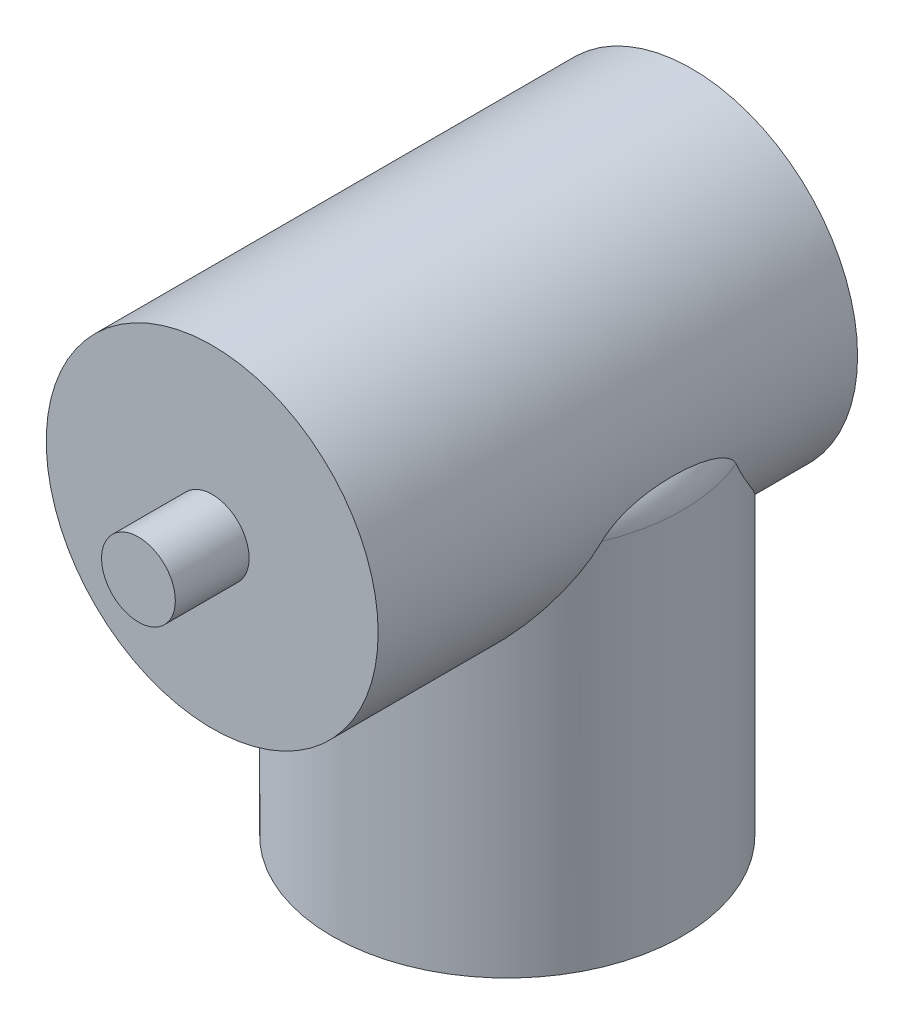
ISO-10303-21;
HEADER;
FILE_DESCRIPTION(('STEP AP214'),'2;1');
FILE_NAME('part.step','',(''),(''),'','','');
FILE_SCHEMA(('AUTOMOTIVE_DESIGN { 1 0 10303 214 1 1 1 1 }'));
ENDSEC;
DATA;
#1=APPLICATION_CONTEXT('core data for automotive mechanical design processes');
#2=APPLICATION_PROTOCOL_DEFINITION('international standard','automotive_design',2000,#1);
#3=PRODUCT_CONTEXT('',#1,'mechanical');
#4=PRODUCT('Part','Part','',(#3));
#5=PRODUCT_RELATED_PRODUCT_CATEGORY('part','',(#4));
#6=PRODUCT_DEFINITION_FORMATION('','',#4);
#7=PRODUCT_DEFINITION_CONTEXT('part definition',#1,'design');
#8=PRODUCT_DEFINITION('design','',#6,#7);
#9=PRODUCT_DEFINITION_SHAPE('','',#8);
#10=(LENGTH_UNIT() NAMED_UNIT(*) SI_UNIT(.MILLI.,.METRE.));
#11=(NAMED_UNIT(*) PLANE_ANGLE_UNIT() SI_UNIT($,.RADIAN.));
#12=(NAMED_UNIT(*) SI_UNIT($,.STERADIAN.) SOLID_ANGLE_UNIT());
#13=UNCERTAINTY_MEASURE_WITH_UNIT(LENGTH_MEASURE(1.E-05),#10,'distance_accuracy_value','');
#14=(GEOMETRIC_REPRESENTATION_CONTEXT(3) GLOBAL_UNCERTAINTY_ASSIGNED_CONTEXT((#13)) GLOBAL_UNIT_ASSIGNED_CONTEXT((#10,
#11,#12)) REPRESENTATION_CONTEXT('',''));
#15=CARTESIAN_POINT('',(0.,0.,0.));
#16=DIRECTION('',(0.,0.,1.));
#17=DIRECTION('',(1.,0.,0.));
#18=AXIS2_PLACEMENT_3D('',#15,#16,#17);
#19=CARTESIAN_POINT('',(0.,0.,130.));
#20=DIRECTION('',(0.,0.,-1.));
#21=DIRECTION('',(-1.,0.,0.));
#22=AXIS2_PLACEMENT_3D('',#19,#20,#21);
#23=CYLINDRICAL_SURFACE('',#22,45.);
#24=CARTESIAN_POINT('',(45.,0.,34.7930936742544));
#25=CARTESIAN_POINT('',(45.0000036282625,-0.240507951588875,34.7931160998261));
#26=CARTESIAN_POINT('',(44.998071195291,-0.480973921860188,34.7873848131458));
#27=CARTESIAN_POINT('',(44.9903722624058,-0.961261871798909,34.7646260219081));
#28=CARTESIAN_POINT('',(44.9846065392307,-1.20108397205098,34.7476008058382));
#29=CARTESIAN_POINT('',(44.9616573852844,-1.91757737206649,34.6800213031901));
#30=CARTESIAN_POINT('',(44.9388215194324,-2.3926015526503,34.6129608129489));
#31=CARTESIAN_POINT('',(44.8793568256426,-3.3253443360846,34.4403940057051));
#32=CARTESIAN_POINT('',(44.8429925161905,-3.78322048158098,34.3356261745172));
#33=CARTESIAN_POINT('',(44.757353575303,-4.68896816442022,34.0925829307832));
#34=CARTESIAN_POINT('',(44.7080699619074,-5.13683250517412,33.9542842114137));
#35=CARTESIAN_POINT('',(44.5635631856544,-6.2934252276618,33.5559461687162));
#36=CARTESIAN_POINT('',(44.4587286141598,-6.99316938807303,33.2733480959356));
#37=CARTESIAN_POINT('',(44.2213570020724,-8.36399233349041,32.6555143363363));
#38=CARTESIAN_POINT('',(44.0888003397471,-9.03505040706717,32.3202414082233));
#39=CARTESIAN_POINT('',(43.7967371617629,-10.3590815867803,31.6085468098105));
#40=CARTESIAN_POINT('',(43.6369354009632,-11.0117539558126,31.2316922803975));
#41=CARTESIAN_POINT('',(43.2931132328243,-12.2941818685559,30.4516449650358));
#42=CARTESIAN_POINT('',(43.1090978237685,-12.9239421077312,30.0484576234448));
#43=CARTESIAN_POINT('',(42.6922460870323,-14.2447270562184,29.1700157752598));
#44=CARTESIAN_POINT('',(42.4561725214174,-14.9330299130196,28.6922202778851));
#45=CARTESIAN_POINT('',(41.9549422766588,-16.2881759973451,27.7215009331251));
#46=CARTESIAN_POINT('',(41.6897792599685,-16.9550145074665,27.2285738060145));
#47=CARTESIAN_POINT('',(41.1304578077295,-18.2700948931789,26.2331802833347));
#48=CARTESIAN_POINT('',(40.8362745659815,-18.9183202366313,25.7307060283887));
#49=CARTESIAN_POINT('',(40.219145282569,-20.1971359564553,24.7211465473791));
#50=CARTESIAN_POINT('',(39.8962014987048,-20.8277277120258,24.214061686065));
#51=CARTESIAN_POINT('',(39.2222371655498,-22.0706716400943,23.2000783745839));
#52=CARTESIAN_POINT('',(38.8712916545365,-22.6830669000828,22.6931828557604));
#53=CARTESIAN_POINT('',(38.140299869527,-23.8917629003121,21.6811506678406));
#54=CARTESIAN_POINT('',(37.7602528798444,-24.4880632442461,21.17601404232));
#55=CARTESIAN_POINT('',(36.9708882048631,-25.6642702244276,20.1702857138484));
#56=CARTESIAN_POINT('',(36.5615858698652,-26.2441852383991,19.6696917804992));
#57=CARTESIAN_POINT('',(35.7131543471676,-27.3875397624245,18.6751224963607));
#58=CARTESIAN_POINT('',(35.2740262921399,-27.9509798969731,18.1811468950833));
#59=CARTESIAN_POINT('',(34.0583510323342,-29.4359228737015,16.8709897962685));
#60=CARTESIAN_POINT('',(33.2543128805492,-30.3421023822349,16.0626422985321));
#61=CARTESIAN_POINT('',(31.5589504668134,-32.1017995963853,14.4806021302215));
#62=CARTESIAN_POINT('',(30.6676179478878,-32.9553123078997,13.7069127479861));
#63=CARTESIAN_POINT('',(28.7969000585207,-34.6018568354736,12.2054965075945));
#64=CARTESIAN_POINT('',(27.8176268767559,-35.3949633906701,11.477713049292));
#65=CARTESIAN_POINT('',(26.2820643937557,-36.5329833506146,10.4287048121694));
#66=CARTESIAN_POINT('',(25.7591510445506,-36.9036859390092,10.0861751987775));
#67=CARTESIAN_POINT('',(24.6909062769729,-37.6267891452383,9.41667133435715));
#68=CARTESIAN_POINT('',(24.1455694193499,-37.97918527501,9.08970089949507));
#69=CARTESIAN_POINT('',(22.7492460410974,-38.8386965643132,8.29079287266678));
#70=CARTESIAN_POINT('',(21.8840686720489,-39.3331841110627,7.82985292098211));
#71=CARTESIAN_POINT('',(20.104962714454,-40.2715974246874,6.95324005146495));
#72=CARTESIAN_POINT('',(19.1910462142914,-40.715535644065,6.53755598624683));
#73=CARTESIAN_POINT('',(17.3170948529587,-41.5471876021261,5.7575089423702));
#74=CARTESIAN_POINT('',(16.3570720739146,-41.9349159647009,5.39313261589553));
#75=CARTESIAN_POINT('',(14.3944988304117,-42.6484209693281,4.72171351042527));
#76=CARTESIAN_POINT('',(13.3919477305607,-42.9741966853809,4.41467158840204));
#77=CARTESIAN_POINT('',(11.8562665987485,-43.4133208029996,4.00039061755079));
#78=CARTESIAN_POINT('',(11.3365387816943,-43.551973204426,3.86950511081296));
#79=CARTESIAN_POINT('',(10.2887304182122,-43.8113356390125,3.6245613925961));
#80=CARTESIAN_POINT('',(9.76065091693068,-43.9320478978852,3.51050109374001));
#81=CARTESIAN_POINT('',(8.69705781355228,-44.1549147495123,3.29983752451308));
#82=CARTESIAN_POINT('',(8.1615430676785,-44.2570664522411,3.20323697277557));
#83=CARTESIAN_POINT('',(7.0843501431601,-44.4422161841727,3.02809693766889));
#84=CARTESIAN_POINT('',(6.54267279180972,-44.5252167531986,2.94955505936367));
#85=CARTESIAN_POINT('',(5.45465409277616,-44.6715553170366,2.81104687512732));
#86=CARTESIAN_POINT('',(4.90831586886866,-44.7349055582274,2.75106899988191));
#87=CARTESIAN_POINT('',(3.81202333613277,-44.8416297853095,2.65001089977105));
#88=CARTESIAN_POINT('',(3.26206950803031,-44.8850063744878,2.60892821218203));
#89=CARTESIAN_POINT('',(2.15986187800102,-44.9515266176853,2.54592083082813));
#90=CARTESIAN_POINT('',(1.60760819989963,-44.9746713472048,2.52399511870236));
#91=CARTESIAN_POINT('',(0.50225262662826,-45.0005946278448,2.49943678536948));
#92=CARTESIAN_POINT('',(-0.0508492365161487,-45.0033739298595,2.4968034528325));
#93=CARTESIAN_POINT('',(-1.55441214284421,-44.9831843134049,2.51593093340261));
#94=CARTESIAN_POINT('',(-2.50450704385429,-44.9402555263611,2.5566020433076));
#95=CARTESIAN_POINT('',(-4.39575377643984,-44.7948346029611,2.69432724613187));
#96=CARTESIAN_POINT('',(-5.33690660479029,-44.6923491864812,2.7913749779802));
#97=CARTESIAN_POINT('',(-7.20384849015774,-44.429642834535,3.04000253090832));
#98=CARTESIAN_POINT('',(-8.12963676858981,-44.2694189825126,3.19158510671965));
#99=CARTESIAN_POINT('',(-9.95982483745956,-43.8939032031982,3.54657179106664));
#100=CARTESIAN_POINT('',(-10.8642236660164,-43.6786088045153,3.74997822529045));
#101=CARTESIAN_POINT('',(-12.6410440404598,-43.197754040548,4.2038245642162));
#102=CARTESIAN_POINT('',(-13.5136286179818,-42.9325124224432,4.45396614498949));
#103=CARTESIAN_POINT('',(-15.228660044957,-42.3545372534083,4.99836219852296));
#104=CARTESIAN_POINT('',(-16.0711080331654,-42.0418054993095,5.29261500229054));
#105=CARTESIAN_POINT('',(-17.7229569589944,-41.3725887701035,5.92134346339557));
#106=CARTESIAN_POINT('',(-18.5323549891554,-41.016099956619,6.2558226493466));
#107=CARTESIAN_POINT('',(-20.1160849836041,-40.2630368973174,6.96112550458363));
#108=CARTESIAN_POINT('',(-20.8904094814759,-39.8664541738855,7.33195685981064));
#109=CARTESIAN_POINT('',(-22.2061073786024,-39.1445593375431,8.00554404833076));
#110=CARTESIAN_POINT('',(-22.7557838695149,-38.8274620757475,8.30099028028921));
#111=CARTESIAN_POINT('',(-23.8345892468138,-38.1747270676997,8.90808550168421));
#112=CARTESIAN_POINT('',(-24.363721754583,-37.839092614585,9.21973161263253));
#113=CARTESIAN_POINT('',(-25.9205588803031,-36.8059280457755,10.1771534840128));
#114=CARTESIAN_POINT('',(-26.9174562905248,-36.0822731546245,10.8452852623041));
#115=CARTESIAN_POINT('',(-28.8306338032502,-34.5728785726371,12.2316982554511));
#116=CARTESIAN_POINT('',(-29.7466937254224,-33.7869797483682,12.9501074267727));
#117=CARTESIAN_POINT('',(-31.4965034195686,-32.1620217867968,14.4257175103004));
#118=CARTESIAN_POINT('',(-32.3302582901287,-31.322965947728,15.1829160151876));
#119=CARTESIAN_POINT('',(-33.6479225354269,-29.8900857560733,16.4649049427348));
#120=CARTESIAN_POINT('',(-34.1545927389672,-29.3095843852055,16.9814365058233));
#121=CARTESIAN_POINT('',(-35.1333427565068,-28.1289218173229,18.0248561467357));
#122=CARTESIAN_POINT('',(-35.6054202057411,-27.528759280319,18.5517449294636));
#123=CARTESIAN_POINT('',(-36.5157344463686,-26.3093225196826,19.6134828802533));
#124=CARTESIAN_POINT('',(-36.9539512249926,-25.6900372919729,20.1483365364462));
#125=CARTESIAN_POINT('',(-37.7967562491841,-24.4331283314578,21.2229014765962));
#126=CARTESIAN_POINT('',(-38.201345591466,-23.7955051976327,21.7626126014965));
#127=CARTESIAN_POINT('',(-38.9768487035338,-22.5027272332834,22.8431067707508));
#128=CARTESIAN_POINT('',(-39.3478063716351,-21.8475967448983,23.3838874481645));
#129=CARTESIAN_POINT('',(-40.0570157652837,-20.5183591798848,24.4636991714409));
#130=CARTESIAN_POINT('',(-40.3952651068922,-19.8442507246679,25.0027300870097));
#131=CARTESIAN_POINT('',(-41.038922442814,-18.4764107832329,26.0741353189306));
#132=CARTESIAN_POINT('',(-41.3443580320239,-17.7826964148081,26.6065148904433));
#133=CARTESIAN_POINT('',(-41.9225830293313,-16.3730721494187,27.6592908295468));
#134=CARTESIAN_POINT('',(-42.1953791816356,-15.6571668763318,28.1796896546806));
#135=CARTESIAN_POINT('',(-42.6480783134051,-14.3698263885657,29.0815064542531));
#136=CARTESIAN_POINT('',(-42.834803780037,-13.8036604954542,29.4670194078451));
#137=CARTESIAN_POINT('',(-43.1883442604206,-12.6541928061568,30.2214685707377));
#138=CARTESIAN_POINT('',(-43.3551585922286,-12.0708904239092,30.5904042120061));
#139=CARTESIAN_POINT('',(-43.6679883970757,-10.8849778475441,31.3048468956195));
#140=CARTESIAN_POINT('',(-43.8140138140445,-10.2823770545214,31.6503650974722));
#141=CARTESIAN_POINT('',(-44.0840562522068,-9.05487400896909,32.3089734384497));
#142=CARTESIAN_POINT('',(-44.2080804189199,-8.42997907657094,32.622074092272));
#143=CARTESIAN_POINT('',(-44.3995733951759,-7.3408571751413,33.1187416202363));
#144=CARTESIAN_POINT('',(-44.4729970848857,-6.88279565239096,33.3134883442857));
#145=CARTESIAN_POINT('',(-44.6068889315348,-5.95363326303694,33.6747878693232));
#146=CARTESIAN_POINT('',(-44.6673557561122,-5.48253106107184,33.8413377704466));
#147=CARTESIAN_POINT('',(-44.7739840512567,-4.52979824938127,34.139187950024));
#148=CARTESIAN_POINT('',(-44.8202047187658,-4.04822035942632,34.2706337832357));
#149=CARTESIAN_POINT('',(-44.8974862314992,-3.07469554903564,34.492594130078));
#150=CARTESIAN_POINT('',(-44.9285586829263,-2.58275686923047,34.5831399763858));
#151=CARTESIAN_POINT('',(-44.9675877777653,-1.74223144878157,34.6974321018896));
#152=CARTESIAN_POINT('',(-44.9796975382166,-1.39543721945125,34.7331106183338));
#153=CARTESIAN_POINT('',(-44.9959257211095,-0.699132593703697,34.7810366522511));
#154=CARTESIAN_POINT('',(-45.0000228521314,-0.349617431613069,34.7932217410149));
#155=CARTESIAN_POINT('',(-45.,0.,34.7930936742545));
#156=B_SPLINE_CURVE_WITH_KNOTS('',3,(#24,#25,#26,#27,#28,#29,#30,#31,#32,#33,#34,#35,#36,#37,
#38,#39,#40,#41,#42,#43,#44,#45,#46,#47,#48,#49,#50,#51,#52,#53,#54,#55,#56,#57,#58,#59,#60,#61,
#62,#63,#64,#65,#66,#67,#68,#69,#70,#71,#72,#73,#74,#75,#76,#77,#78,#79,#80,#81,#82,#83,#84,#85,
#86,#87,#88,#89,#90,#91,#92,#93,#94,#95,#96,#97,#98,#99,#100,#101,#102,#103,#104,#105,#106,#107,
#108,#109,#110,#111,#112,#113,#114,#115,#116,#117,#118,#119,#120,#121,#122,#123,#124,#125,#126,
#127,#128,#129,#130,#131,#132,#133,#134,#135,#136,#137,#138,#139,#140,#141,#142,#143,#144,#145,
#146,#147,#148,#149,#150,#151,#152,#153,#154,#155),.UNSPECIFIED.,.F.,.F.,(4,2,2,2,2,2,2,2,2,2,2,
2,2,2,2,2,2,2,2,2,2,2,2,2,2,2,2,2,2,2,2,2,2,2,2,2,2,2,2,2,2,2,2,2,2,2,2,2,2,2,2,2,2,2,2,2,2,2,2,
2,2,2,2,2,2,4),(0.,0.721367829363491,1.44258953268556,2.8810732361752,4.29279435491907,
5.70549956753271,7.98712620684768,10.2703732835571,12.5801503739989,14.8894514163008,
17.4999345441541,20.1109875362427,22.7242920955627,25.3373916821268,27.9437098923643,
30.5500922198075,33.155116876118,35.7600426583572,40.1252211899129,44.4908130132465,
48.850912554678,51.030573654804,53.2107666289942,56.50153702111,59.7914949911584,
63.0805954841428,66.3697451350923,68.0300394022811,69.6901275156903,71.3504738968749,
73.0105999562304,74.669689311723,76.3285623667913,77.9873472328733,79.6460709375443,
82.4979806020513,85.3495685431834,88.2013005474848,91.0531605509001,93.8874024772038,
96.7215371941588,99.5559206998414,102.390904777225,104.490134752838,106.588992991719,
110.78763462632,114.997380359598,119.206865146098,121.988927338962,124.771179536864,
127.555063755173,130.338857145126,133.118962991697,135.899271313161,138.677222909346,
141.454599509278,143.58389319889,145.713259794532,147.84160440651,149.969256508612,
151.477729406115,152.986357346386,154.488629247572,155.989748327748,157.035410786488,
158.083848058377),.UNSPECIFIED.);
#157=CARTESIAN_POINT('',(43.8748219369606,-9.99999999999999,31.7997252767987));
#158=VERTEX_POINT('',#157);
#159=CARTESIAN_POINT('',(-43.8748219369606,-9.99999999999999,31.7997252767987));
#160=VERTEX_POINT('',#159);
#161=EDGE_CURVE('E74',#158,#160,#156,.T.);
#162=ORIENTED_EDGE('',*,*,#161,.T.);
#163=CARTESIAN_POINT('',(-43.8748219369606,-9.99999999999999,31.7997252767987));
#164=CARTESIAN_POINT('',(-43.9290445672907,-9.76206935781008,31.9304979417745));
#165=CARTESIAN_POINT('',(-43.9794932620527,-9.53182366959213,32.0758524352412));
#166=CARTESIAN_POINT('',(-44.0733699236913,-9.08787784167482,32.3905726903264));
#167=CARTESIAN_POINT('',(-44.1168196435094,-8.87412755687374,32.5598608599886));
#168=CARTESIAN_POINT('',(-44.1969179466877,-8.46610784582609,32.9153318990746));
#169=CARTESIAN_POINT('',(-44.2336638010246,-8.27158243735672,33.1012028621355));
#170=CARTESIAN_POINT('',(-44.3019433357629,-7.89771776196111,33.4887782015503));
#171=CARTESIAN_POINT('',(-44.3334719138641,-7.7183934437261,33.6904977963275));
#172=CARTESIAN_POINT('',(-44.4035863945898,-7.30623138637748,34.1894176410765));
#173=CARTESIAN_POINT('',(-44.4400032234162,-7.08042007315626,34.492724971289));
#174=CARTESIAN_POINT('',(-44.50561280009,-6.65556879660021,35.1181227522136));
#175=CARTESIAN_POINT('',(-44.5348041426219,-6.45653404458275,35.440216841813));
#176=CARTESIAN_POINT('',(-44.5875870822216,-6.0813838200141,36.1013014351377));
#177=CARTESIAN_POINT('',(-44.6111313472665,-5.90546730562128,36.4404077803469));
#178=CARTESIAN_POINT('',(-44.6535007208682,-5.57605967261332,37.1297151280516));
#179=CARTESIAN_POINT('',(-44.6723238702511,-5.42257787496876,37.4799206688262));
#180=CARTESIAN_POINT('',(-44.704797396203,-5.1476795031043,38.1596457141646));
#181=CARTESIAN_POINT('',(-44.7187451306633,-5.02466639535578,38.4885109570211));
#182=CARTESIAN_POINT('',(-44.7440332254003,-4.79425863848421,39.1516768421379));
#183=CARTESIAN_POINT('',(-44.7553740295129,-4.68686133188113,39.4859765487759));
#184=CARTESIAN_POINT('',(-44.7759325522316,-4.48620477244484,40.1591452325104));
#185=CARTESIAN_POINT('',(-44.7851484392782,-4.3929577398429,40.4980178869316));
#186=CARTESIAN_POINT('',(-44.8018239943206,-4.21949662480994,41.1791221115216));
#187=CARTESIAN_POINT('',(-44.8092835937382,-4.13928305133802,41.5213538123086));
#188=CARTESIAN_POINT('',(-44.8227380889567,-3.99094997753649,42.2079035981145));
#189=CARTESIAN_POINT('',(-44.8287351741619,-3.92281244151993,42.5522177638087));
#190=CARTESIAN_POINT('',(-44.8395177906119,-3.79757681338372,43.2428865282992));
#191=CARTESIAN_POINT('',(-44.8443032195842,-3.74047965324668,43.5892412968138));
#192=CARTESIAN_POINT('',(-44.8528471224679,-3.63659432750565,44.2833356261615));
#193=CARTESIAN_POINT('',(-44.8566060703976,-3.58980140544967,44.6310744723151));
#194=CARTESIAN_POINT('',(-44.8632440663945,-3.50586568324087,45.3277272344447));
#195=CARTESIAN_POINT('',(-44.8661230808912,-3.46872325127489,45.6766411947396));
#196=CARTESIAN_POINT('',(-44.8722869434683,-3.38824598701114,46.5398189728955));
#197=CARTESIAN_POINT('',(-44.8751246573728,-3.35022923320176,47.054587593414));
#198=CARTESIAN_POINT('',(-44.8793706690392,-3.29285504372044,48.0851248110815));
#199=CARTESIAN_POINT('',(-44.8807790314402,-3.2734967642636,48.6008933619541));
#200=CARTESIAN_POINT('',(-44.8822798580594,-3.25285434477848,49.6336339539045));
#201=CARTESIAN_POINT('',(-44.8823701710615,-3.25159975219422,50.1506065853974));
#202=CARTESIAN_POINT('',(-44.8812373304389,-3.26720138919203,51.1843075812799));
#203=CARTESIAN_POINT('',(-44.8800141177088,-3.28405843375482,51.7010359336309));
#204=CARTESIAN_POINT('',(-44.8765019840403,-3.33166876800506,52.6404130400474));
#205=CARTESIAN_POINT('',(-44.8744450958677,-3.35936696680216,53.0632190665972));
#206=CARTESIAN_POINT('',(-44.8692679941826,-3.42782397044977,53.9077947724024));
#207=CARTESIAN_POINT('',(-44.8661477345542,-3.46858334172875,54.3295644059126));
#208=CARTESIAN_POINT('',(-44.8586695278194,-3.56399564769484,55.1718372356527));
#209=CARTESIAN_POINT('',(-44.8543106880716,-3.61865859966456,55.5923392966528));
#210=CARTESIAN_POINT('',(-44.8441116923025,-3.74293242919448,56.431113070055));
#211=CARTESIAN_POINT('',(-44.8382715847673,-3.81254281747217,56.8493848550028));
#212=CARTESIAN_POINT('',(-44.8248019576579,-3.9677684186533,57.6812817434802));
#213=CARTESIAN_POINT('',(-44.8171793800071,-4.05332128665792,58.0949185104198));
#214=CARTESIAN_POINT('',(-44.7996909479293,-4.24225299362463,58.9181313642418));
#215=CARTESIAN_POINT('',(-44.7898248575414,-4.34563370734974,59.3277070192657));
#216=CARTESIAN_POINT('',(-44.7672830495646,-4.57201302830633,60.1407530026016));
#217=CARTESIAN_POINT('',(-44.7546112093046,-4.69498449748423,60.5442309433761));
#218=CARTESIAN_POINT('',(-44.7256966546271,-4.9628881755082,61.3436273555614));
#219=CARTESIAN_POINT('',(-44.7094551705666,-5.10781281237202,61.7395483806534));
#220=CARTESIAN_POINT('',(-44.676795046143,-5.38502814062115,62.4287641267327));
#221=CARTESIAN_POINT('',(-44.6613284865606,-5.51218827208615,62.7241662427439));
#222=CARTESIAN_POINT('',(-44.6271821916884,-5.7821404324172,63.3076098866276));
#223=CARTESIAN_POINT('',(-44.6085023476466,-5.92493299029489,63.5956511649974));
#224=CARTESIAN_POINT('',(-44.5672585835724,-6.2275837179465,64.1625503394805));
#225=CARTESIAN_POINT('',(-44.5446929791226,-6.38744927714158,64.4414041902716));
#226=CARTESIAN_POINT('',(-44.4948953956537,-6.72558630017227,64.9872795333399));
#227=CARTESIAN_POINT('',(-44.4676645330274,-6.9038533564962,65.2543038372228));
#228=CARTESIAN_POINT('',(-44.4139928523622,-7.24014378752404,65.7181179306358));
#229=CARTESIAN_POINT('',(-44.3886190967471,-7.39439175824265,65.9177534288435));
#230=CARTESIAN_POINT('',(-44.3338967544661,-7.71571019513101,66.3057754153523));
#231=CARTESIAN_POINT('',(-44.304547579336,-7.88278255805059,66.4941602323038));
#232=CARTESIAN_POINT('',(-44.2098938751097,-8.40292994232272,67.0377488576159));
#233=CARTESIAN_POINT('',(-44.1377584513967,-8.77640141524558,67.3734695625411));
#234=CARTESIAN_POINT('',(-44.0270944080617,-9.30768176551914,67.7673636732855));
#235=CARTESIAN_POINT('',(-43.9984791353239,-9.4421149978121,67.8606566295235));
#236=CARTESIAN_POINT('',(-43.9386399769737,-9.7167754291299,68.0378314730244));
#237=CARTESIAN_POINT('',(-43.9074122210368,-9.85701106318471,68.1216989500571));
#238=CARTESIAN_POINT('',(-43.8748219369606,-9.99999999999999,68.2002747232013));
#239=B_SPLINE_CURVE_WITH_KNOTS('',3,(#163,#164,#165,#166,#167,#168,#169,#170,#171,#172,#173,
#174,#175,#176,#177,#178,#179,#180,#181,#182,#183,#184,#185,#186,#187,#188,#189,#190,#191,#192,
#193,#194,#195,#196,#197,#198,#199,#200,#201,#202,#203,#204,#205,#206,#207,#208,#209,#210,#211,
#212,#213,#214,#215,#216,#217,#218,#219,#220,#221,#222,#223,#224,#225,#226,#227,#228,#229,#230,
#231,#232,#233,#234,#235,#236,#237,#238),.UNSPECIFIED.,.F.,.F.,(4,2,2,2,2,2,2,2,2,2,2,2,2,2,2,2,
2,2,2,2,2,2,2,2,2,2,2,2,2,2,2,2,2,2,2,2,2,4),(0.,0.829414614121261,1.6561994655147,
2.46982051951251,3.28423262107894,4.42204079432069,5.56007009109992,6.70732845155671,
7.85506211779741,8.90881499095399,9.96238832718096,11.0168664178401,12.0713856761819,
13.1243164779707,14.1773361250326,15.2298686729441,16.2824413713307,17.8305924485084,
19.3786735109683,20.9292809469087,22.479958159429,23.7509234810473,25.0219439285267,
26.2938827305117,27.5657799037821,28.83280376416,30.0999609451658,31.3653778227443,
32.6303592283981,33.595889295935,34.5614520477532,35.5274344147044,36.4931859448597,
37.2532408938674,38.013408473726,39.5261343841627,40.0241758637797,40.5229687077075),.UNSPECIFIED.);
#240=CARTESIAN_POINT('',(-43.8748219369606,-9.99999999999999,68.2002747232013));
#241=VERTEX_POINT('',#240);
#242=EDGE_CURVE('E49',#160,#241,#239,.T.);
#243=ORIENTED_EDGE('',*,*,#242,.T.);
#244=CARTESIAN_POINT('',(-45.,0.,65.2069063257456));
#245=CARTESIAN_POINT('',(-45.0000036282625,-0.240507951588874,65.2068839001739));
#246=CARTESIAN_POINT('',(-44.998071195291,-0.480973921860187,65.2126151868542));
#247=CARTESIAN_POINT('',(-44.9903722624058,-0.961261871798908,65.2353739780919));
#248=CARTESIAN_POINT('',(-44.9846065392307,-1.20108397205098,65.2523991941618));
#249=CARTESIAN_POINT('',(-44.9616573852844,-1.91757737206649,65.3199786968099));
#250=CARTESIAN_POINT('',(-44.9388215194324,-2.39260155265029,65.3870391870511));
#251=CARTESIAN_POINT('',(-44.8793568256426,-3.3253443360846,65.5596059942949));
#252=CARTESIAN_POINT('',(-44.8429925161905,-3.78322048158098,65.6643738254828));
#253=CARTESIAN_POINT('',(-44.757353575303,-4.68896816442021,65.9074170692168));
#254=CARTESIAN_POINT('',(-44.7080699619074,-5.13683250517411,66.0457157885863));
#255=CARTESIAN_POINT('',(-44.5635631856544,-6.29342522766179,66.4440538312839));
#256=CARTESIAN_POINT('',(-44.4587286141598,-6.99316938807303,66.7266519040644));
#257=CARTESIAN_POINT('',(-44.2213570020724,-8.36399233349042,67.3444856636637));
#258=CARTESIAN_POINT('',(-44.0888003397471,-9.03505040706717,67.6797585917767));
#259=CARTESIAN_POINT('',(-43.7967371617629,-10.3590815867803,68.3914531901895));
#260=CARTESIAN_POINT('',(-43.6369354009632,-11.0117539558126,68.7683077196025));
#261=CARTESIAN_POINT('',(-43.2931132328243,-12.2941818685559,69.5483550349642));
#262=CARTESIAN_POINT('',(-43.1090978237685,-12.9239421077312,69.9515423765552));
#263=CARTESIAN_POINT('',(-42.6922460870323,-14.2447270562184,70.8299842247403));
#264=CARTESIAN_POINT('',(-42.4561725214174,-14.9330299130196,71.3077797221149));
#265=CARTESIAN_POINT('',(-41.9549422766588,-16.2881759973451,72.2784990668749));
#266=CARTESIAN_POINT('',(-41.6897792599685,-16.9550145074665,72.7714261939855));
#267=CARTESIAN_POINT('',(-41.1304578077295,-18.2700948931789,73.7668197166654));
#268=CARTESIAN_POINT('',(-40.8362745659815,-18.9183202366312,74.2692939716113));
#269=CARTESIAN_POINT('',(-40.219145282569,-20.1971359564553,75.2788534526209));
#270=CARTESIAN_POINT('',(-39.8962014987048,-20.8277277120258,75.785938313935));
#271=CARTESIAN_POINT('',(-39.2222371655498,-22.0706716400943,76.7999216254161));
#272=CARTESIAN_POINT('',(-38.8712916545365,-22.6830669000828,77.3068171442396));
#273=CARTESIAN_POINT('',(-38.140299869527,-23.8917629003121,78.3188493321594));
#274=CARTESIAN_POINT('',(-37.7602528798444,-24.4880632442461,78.82398595768));
#275=CARTESIAN_POINT('',(-36.9708882048631,-25.6642702244276,79.8297142861516));
#276=CARTESIAN_POINT('',(-36.5615858698652,-26.2441852383991,80.3303082195008));
#277=CARTESIAN_POINT('',(-35.7131543471676,-27.3875397624245,81.3248775036393));
#278=CARTESIAN_POINT('',(-35.2740262921399,-27.9509798969731,81.8188531049167));
#279=CARTESIAN_POINT('',(-34.0583510323342,-29.4359228737015,83.1290102037315));
#280=CARTESIAN_POINT('',(-33.2543128805492,-30.3421023822349,83.9373577014679));
#281=CARTESIAN_POINT('',(-31.5589504668134,-32.1017995963853,85.5193978697785));
#282=CARTESIAN_POINT('',(-30.6676179478878,-32.9553123078997,86.293087252014));
#283=CARTESIAN_POINT('',(-28.7969000585207,-34.6018568354736,87.7945034924055));
#284=CARTESIAN_POINT('',(-27.8176268767559,-35.39496339067,88.5222869507081));
#285=CARTESIAN_POINT('',(-26.2820643937557,-36.5329833506146,89.5712951878306));
#286=CARTESIAN_POINT('',(-25.7591510445506,-36.9036859390092,89.9138248012225));
#287=CARTESIAN_POINT('',(-24.6909062769729,-37.6267891452383,90.5833286656429));
#288=CARTESIAN_POINT('',(-24.1455694193499,-37.97918527501,90.9102991005049));
#289=CARTESIAN_POINT('',(-22.7492460410973,-38.8386965643132,91.7092071273332));
#290=CARTESIAN_POINT('',(-21.8840686720489,-39.3331841110627,92.1701470790179));
#291=CARTESIAN_POINT('',(-20.104962714454,-40.2715974246874,93.0467599485351));
#292=CARTESIAN_POINT('',(-19.1910462142914,-40.715535644065,93.4624440137532));
#293=CARTESIAN_POINT('',(-17.3170948529587,-41.5471876021261,94.2424910576298));
#294=CARTESIAN_POINT('',(-16.3570720739145,-41.9349159647009,94.6068673841045));
#295=CARTESIAN_POINT('',(-14.3944988304117,-42.6484209693281,95.2782864895747));
#296=CARTESIAN_POINT('',(-13.3919477305607,-42.9741966853809,95.585328411598));
#297=CARTESIAN_POINT('',(-11.8562665987485,-43.4133208029996,95.9996093824492));
#298=CARTESIAN_POINT('',(-11.3365387816943,-43.5519732044261,96.130494889187));
#299=CARTESIAN_POINT('',(-10.2887304182122,-43.8113356390125,96.3754386074039));
#300=CARTESIAN_POINT('',(-9.76065091693067,-43.9320478978852,96.48949890626));
#301=CARTESIAN_POINT('',(-8.69705781355227,-44.1549147495123,96.7001624754869));
#302=CARTESIAN_POINT('',(-8.1615430676785,-44.2570664522411,96.7967630272244));
#303=CARTESIAN_POINT('',(-7.08435014316009,-44.4422161841727,96.9719030623311));
#304=CARTESIAN_POINT('',(-6.54267279180971,-44.5252167531986,97.0504449406363));
#305=CARTESIAN_POINT('',(-5.45465409277615,-44.6715553170366,97.1889531248727));
#306=CARTESIAN_POINT('',(-4.90831586886865,-44.7349055582274,97.2489310001181));
#307=CARTESIAN_POINT('',(-3.81202333613276,-44.8416297853095,97.349989100229));
#308=CARTESIAN_POINT('',(-3.26206950803031,-44.8850063744878,97.391071787818));
#309=CARTESIAN_POINT('',(-2.15986187800102,-44.9515266176853,97.4540791691719));
#310=CARTESIAN_POINT('',(-1.60760819989963,-44.9746713472048,97.4760048812976));
#311=CARTESIAN_POINT('',(-0.502252626628259,-45.0005946278448,97.5005632146305));
#312=CARTESIAN_POINT('',(0.0508492365161498,-45.0033739298595,97.5031965471675));
#313=CARTESIAN_POINT('',(1.55441214284422,-44.9831843134049,97.4840690665974));
#314=CARTESIAN_POINT('',(2.50450704385429,-44.9402555263611,97.4433979566924));
#315=CARTESIAN_POINT('',(4.39575377643985,-44.7948346029611,97.3056727538681));
#316=CARTESIAN_POINT('',(5.3369066047903,-44.6923491864812,97.2086250220198));
#317=CARTESIAN_POINT('',(7.20384849015775,-44.429642834535,96.9599974690917));
#318=CARTESIAN_POINT('',(8.12963676858982,-44.2694189825126,96.8084148932803));
#319=CARTESIAN_POINT('',(9.95982483745956,-43.8939032031982,96.4534282089334));
#320=CARTESIAN_POINT('',(10.8642236660164,-43.6786088045153,96.2500217747096));
#321=CARTESIAN_POINT('',(12.6410440404598,-43.197754040548,95.7961754357838));
#322=CARTESIAN_POINT('',(13.5136286179818,-42.9325124224432,95.5460338550105));
#323=CARTESIAN_POINT('',(15.228660044957,-42.3545372534083,95.001637801477));
#324=CARTESIAN_POINT('',(16.0711080331654,-42.0418054993095,94.7073849977095));
#325=CARTESIAN_POINT('',(17.7229569589944,-41.3725887701035,94.0786565366044));
#326=CARTESIAN_POINT('',(18.5323549891554,-41.016099956619,93.7441773506534));
#327=CARTESIAN_POINT('',(20.1160849836041,-40.2630368973174,93.0388744954164));
#328=CARTESIAN_POINT('',(20.8904094814759,-39.8664541738855,92.6680431401894));
#329=CARTESIAN_POINT('',(22.2061073786024,-39.1445593375431,91.9944559516693));
#330=CARTESIAN_POINT('',(22.7557838695149,-38.8274620757475,91.6990097197108));
#331=CARTESIAN_POINT('',(23.8345892468138,-38.1747270676997,91.0919144983158));
#332=CARTESIAN_POINT('',(24.363721754583,-37.839092614585,90.7802683873675));
#333=CARTESIAN_POINT('',(25.9205588803031,-36.8059280457755,89.8228465159872));
#334=CARTESIAN_POINT('',(26.9174562905248,-36.0822731546245,89.1547147376958));
#335=CARTESIAN_POINT('',(28.8306338032502,-34.5728785726371,87.7683017445489));
#336=CARTESIAN_POINT('',(29.7466937254224,-33.7869797483682,87.0498925732273));
#337=CARTESIAN_POINT('',(31.4965034195686,-32.1620217867968,85.5742824896996));
#338=CARTESIAN_POINT('',(32.3302582901288,-31.322965947728,84.8170839848124));
#339=CARTESIAN_POINT('',(33.6479225354269,-29.8900857560733,83.5350950572652));
#340=CARTESIAN_POINT('',(34.1545927389672,-29.3095843852055,83.0185634941766));
#341=CARTESIAN_POINT('',(35.1333427565068,-28.1289218173228,81.9751438532643));
#342=CARTESIAN_POINT('',(35.6054202057411,-27.5287592803189,81.4482550705363));
#343=CARTESIAN_POINT('',(36.5157344463686,-26.3093225196826,80.3865171197467));
#344=CARTESIAN_POINT('',(36.9539512249926,-25.6900372919729,79.8516634635537));
#345=CARTESIAN_POINT('',(37.7967562491841,-24.4331283314578,78.7770985234038));
#346=CARTESIAN_POINT('',(38.201345591466,-23.7955051976326,78.2373873985034));
#347=CARTESIAN_POINT('',(38.9768487035339,-22.5027272332834,77.1568932292492));
#348=CARTESIAN_POINT('',(39.3478063716351,-21.8475967448983,76.6161125518355));
#349=CARTESIAN_POINT('',(40.0570157652837,-20.5183591798848,75.5363008285591));
#350=CARTESIAN_POINT('',(40.3952651068922,-19.8442507246678,74.9972699129903));
#351=CARTESIAN_POINT('',(41.038922442814,-18.4764107832329,73.9258646810694));
#352=CARTESIAN_POINT('',(41.3443580320239,-17.7826964148081,73.3934851095567));
#353=CARTESIAN_POINT('',(41.9225830293313,-16.3730721494187,72.3407091704532));
#354=CARTESIAN_POINT('',(42.1953791816356,-15.6571668763318,71.8203103453194));
#355=CARTESIAN_POINT('',(42.6480783134051,-14.3698263885656,70.9184935457469));
#356=CARTESIAN_POINT('',(42.834803780037,-13.8036604954542,70.5329805921549));
#357=CARTESIAN_POINT('',(43.1883442604206,-12.6541928061568,69.7785314292623));
#358=CARTESIAN_POINT('',(43.3551585922286,-12.0708904239092,69.4095957879938));
#359=CARTESIAN_POINT('',(43.6679883970757,-10.8849778475441,68.6951531043805));
#360=CARTESIAN_POINT('',(43.8140138140445,-10.2823770545214,68.3496349025278));
#361=CARTESIAN_POINT('',(44.0840562522068,-9.0548740089691,67.6910265615503));
#362=CARTESIAN_POINT('',(44.2080804189199,-8.42997907657095,67.377925907728));
#363=CARTESIAN_POINT('',(44.3995733951759,-7.34085717514131,66.8812583797638));
#364=CARTESIAN_POINT('',(44.4729970848857,-6.88279565239098,66.6865116557144));
#365=CARTESIAN_POINT('',(44.6068889315348,-5.95363326303696,66.3252121306769));
#366=CARTESIAN_POINT('',(44.6673557561122,-5.48253106107184,66.1586622295534));
#367=CARTESIAN_POINT('',(44.7739840512567,-4.52979824938126,65.860812049976));
#368=CARTESIAN_POINT('',(44.8202047187658,-4.04822035942631,65.7293662167643));
#369=CARTESIAN_POINT('',(44.8974862314992,-3.07469554903563,65.507405869922));
#370=CARTESIAN_POINT('',(44.9285586829263,-2.58275686923046,65.4168600236142));
#371=CARTESIAN_POINT('',(44.9675877777653,-1.74223144878157,65.3025678981105));
#372=CARTESIAN_POINT('',(44.9796975382166,-1.39543721945124,65.2668893816663));
#373=CARTESIAN_POINT('',(44.9959257211095,-0.699132593703677,65.2189633477489));
#374=CARTESIAN_POINT('',(45.0000228521313,-0.349617431613056,65.2067782589851));
#375=CARTESIAN_POINT('',(45.,0.,65.2069063257456));
#376=B_SPLINE_CURVE_WITH_KNOTS('',3,(#244,#245,#246,#247,#248,#249,#250,#251,#252,#253,#254,
#255,#256,#257,#258,#259,#260,#261,#262,#263,#264,#265,#266,#267,#268,#269,#270,#271,#272,#273,
#274,#275,#276,#277,#278,#279,#280,#281,#282,#283,#284,#285,#286,#287,#288,#289,#290,#291,#292,
#293,#294,#295,#296,#297,#298,#299,#300,#301,#302,#303,#304,#305,#306,#307,#308,#309,#310,#311,
#312,#313,#314,#315,#316,#317,#318,#319,#320,#321,#322,#323,#324,#325,#326,#327,#328,#329,#330,
#331,#332,#333,#334,#335,#336,#337,#338,#339,#340,#341,#342,#343,#344,#345,#346,#347,#348,#349,
#350,#351,#352,#353,#354,#355,#356,#357,#358,#359,#360,#361,#362,#363,#364,#365,#366,#367,#368,
#369,#370,#371,#372,#373,#374,#375),.UNSPECIFIED.,.F.,.F.,(4,2,2,2,2,2,2,2,2,2,2,2,2,2,2,2,2,2,
2,2,2,2,2,2,2,2,2,2,2,2,2,2,2,2,2,2,2,2,2,2,2,2,2,2,2,2,2,2,2,2,2,2,2,2,2,2,2,2,2,2,2,2,2,2,2,
4),(0.,0.72136782936349,1.44258953268556,2.8810732361752,4.29279435491907,5.70549956753271,
7.98712620684767,10.2703732835571,12.580150373999,14.8894514163008,17.4999345441541,
20.1109875362427,22.7242920955627,25.3373916821268,27.9437098923643,30.5500922198075,
33.155116876118,35.7600426583572,40.1252211899129,44.4908130132465,48.850912554678,
51.030573654804,53.2107666289942,56.50153702111,59.7914949911583,63.0805954841428,
66.3697451350923,68.0300394022811,69.6901275156903,71.3504738968749,73.0105999562304,
74.669689311723,76.3285623667913,77.9873472328732,79.6460709375442,82.4979806020513,
85.3495685431834,88.2013005474848,91.0531605509,93.8874024772038,96.7215371941587,
99.5559206998413,102.390904777225,104.490134752838,106.588992991719,110.78763462632,
114.997380359598,119.206865146098,121.988927338962,124.771179536864,127.555063755173,
130.338857145126,133.118962991697,135.899271313161,138.677222909346,141.454599509278,
143.58389319889,145.713259794532,147.84160440651,149.969256508612,151.477729406115,
152.986357346386,154.488629247572,155.989748327748,157.035410786488,158.083848058377),.UNSPECIFIED.);
#377=CARTESIAN_POINT('',(43.8748219369606,-9.99999999999999,68.2002747232013));
#378=VERTEX_POINT('',#377);
#379=EDGE_CURVE('E75',#241,#378,#376,.T.);
#380=ORIENTED_EDGE('',*,*,#379,.T.);
#381=CARTESIAN_POINT('',(43.8748219369606,-9.99999999999999,68.2002747232013));
#382=CARTESIAN_POINT('',(43.9290445672907,-9.76206935781007,68.0695020582255));
#383=CARTESIAN_POINT('',(43.9794932620527,-9.53182366959212,67.9241475647589));
#384=CARTESIAN_POINT('',(44.0733699236912,-9.08787784167484,67.6094273096736));
#385=CARTESIAN_POINT('',(44.1168196435094,-8.87412755687376,67.4401391400113));
#386=CARTESIAN_POINT('',(44.1969179466877,-8.46610784582611,67.0846681009254));
#387=CARTESIAN_POINT('',(44.2336638010246,-8.27158243735672,66.8987971378645));
#388=CARTESIAN_POINT('',(44.3019433357628,-7.89771776196111,66.5112217984498));
#389=CARTESIAN_POINT('',(44.3334719138641,-7.71839344372611,66.3095022036725));
#390=CARTESIAN_POINT('',(44.4035863945898,-7.30623138637749,65.8105823589235));
#391=CARTESIAN_POINT('',(44.4400032234162,-7.08042007315625,65.507275028711));
#392=CARTESIAN_POINT('',(44.50561280009,-6.65556879660021,64.8818772477864));
#393=CARTESIAN_POINT('',(44.5348041426219,-6.45653404458276,64.559783158187));
#394=CARTESIAN_POINT('',(44.5875870822216,-6.08138382001412,63.8986985648623));
#395=CARTESIAN_POINT('',(44.6111313472665,-5.90546730562129,63.5595922196531));
#396=CARTESIAN_POINT('',(44.6535007208682,-5.57605967261332,62.8702848719484));
#397=CARTESIAN_POINT('',(44.6723238702511,-5.42257787496876,62.5200793311738));
#398=CARTESIAN_POINT('',(44.704797396203,-5.1476795031043,61.8403542858353));
#399=CARTESIAN_POINT('',(44.7187451306633,-5.02466639535578,61.5114890429789));
#400=CARTESIAN_POINT('',(44.7440332254003,-4.79425863848421,60.8483231578621));
#401=CARTESIAN_POINT('',(44.7553740295129,-4.68686133188114,60.5140234512241));
#402=CARTESIAN_POINT('',(44.7759325522316,-4.48620477244484,59.8408547674896));
#403=CARTESIAN_POINT('',(44.7851484392782,-4.3929577398429,59.5019821130684));
#404=CARTESIAN_POINT('',(44.8018239943206,-4.21949662480994,58.8208778884784));
#405=CARTESIAN_POINT('',(44.8092835937382,-4.13928305133802,58.4786461876914));
#406=CARTESIAN_POINT('',(44.8227380889567,-3.99094997753649,57.7920964018855));
#407=CARTESIAN_POINT('',(44.8287351741619,-3.92281244151993,57.4477822361913));
#408=CARTESIAN_POINT('',(44.8395177906119,-3.79757681338371,56.7571134717008));
#409=CARTESIAN_POINT('',(44.8443032195842,-3.74047965324668,56.4107587031862));
#410=CARTESIAN_POINT('',(44.8528471224679,-3.63659432750566,55.7166643738385));
#411=CARTESIAN_POINT('',(44.8566060703976,-3.58980140544967,55.3689255276849));
#412=CARTESIAN_POINT('',(44.8632440663945,-3.50586568324086,54.6722727655553));
#413=CARTESIAN_POINT('',(44.8661230808912,-3.46872325127489,54.3233588052604));
#414=CARTESIAN_POINT('',(44.8722869434682,-3.38824598701112,53.4601810271043));
#415=CARTESIAN_POINT('',(44.8751246573728,-3.35022923320173,52.9454124065857));
#416=CARTESIAN_POINT('',(44.8793706690392,-3.2928550437204,51.9148751889177));
#417=CARTESIAN_POINT('',(44.8807790314402,-3.27349676426356,51.3991066380449));
#418=CARTESIAN_POINT('',(44.8822798580594,-3.25285434477846,50.3663660460941));
#419=CARTESIAN_POINT('',(44.8823701710615,-3.25159975219422,49.8493934146011));
#420=CARTESIAN_POINT('',(44.8812373304389,-3.26720138919208,48.8156924187182));
#421=CARTESIAN_POINT('',(44.8800141177088,-3.28405843375489,48.2989640663671));
#422=CARTESIAN_POINT('',(44.8765019840402,-3.3316687680052,47.3595869599503));
#423=CARTESIAN_POINT('',(44.8744450958677,-3.35936696680232,46.9367809334005));
#424=CARTESIAN_POINT('',(44.8692679941826,-3.42782397044998,46.0922052275953));
#425=CARTESIAN_POINT('',(44.8661477345542,-3.46858334172898,45.6704355940851));
#426=CARTESIAN_POINT('',(44.8586695278193,-3.56399564769512,44.8281627643451));
#427=CARTESIAN_POINT('',(44.8543106880716,-3.61865859966488,44.407660703345));
#428=CARTESIAN_POINT('',(44.8441116923025,-3.74293242919485,43.5688869299427));
#429=CARTESIAN_POINT('',(44.8382715847672,-3.81254281747256,43.1506151449949));
#430=CARTESIAN_POINT('',(44.8248019576578,-3.96776841865375,42.3187182565176));
#431=CARTESIAN_POINT('',(44.8171793800071,-4.05332128665841,41.905081489578));
#432=CARTESIAN_POINT('',(44.7996909479293,-4.24225299362518,41.0818686357559));
#433=CARTESIAN_POINT('',(44.7898248575413,-4.34563370735032,40.6722929807321));
#434=CARTESIAN_POINT('',(44.7672830495646,-4.57201302830698,39.8592469973962));
#435=CARTESIAN_POINT('',(44.7546112093045,-4.69498449748494,39.4557690566216));
#436=CARTESIAN_POINT('',(44.7256966546271,-4.96288817550898,38.6563726444364));
#437=CARTESIAN_POINT('',(44.7094551705666,-5.10781281237284,38.2604516193445));
#438=CARTESIAN_POINT('',(44.6767950461428,-5.38502814062204,37.5712358732652));
#439=CARTESIAN_POINT('',(44.6613284865605,-5.51218827208705,37.2758337572541));
#440=CARTESIAN_POINT('',(44.6271821916883,-5.78214043241813,36.6923901133705));
#441=CARTESIAN_POINT('',(44.6085023476465,-5.92493299029582,36.4043488350007));
#442=CARTESIAN_POINT('',(44.5672585835723,-6.22758371794747,35.8374496605177));
#443=CARTESIAN_POINT('',(44.5446929791224,-6.38744927714258,35.5585958097267));
#444=CARTESIAN_POINT('',(44.4948953956535,-6.7255863001733,35.0127204666586));
#445=CARTESIAN_POINT('',(44.4676645330272,-6.90385335649723,34.7456961627757));
#446=CARTESIAN_POINT('',(44.413992852362,-7.24014378752508,34.2818820693628));
#447=CARTESIAN_POINT('',(44.3886190967469,-7.39439175824371,34.0822465711551));
#448=CARTESIAN_POINT('',(44.3338967544659,-7.71571019513208,33.6942245846464));
#449=CARTESIAN_POINT('',(44.3045475793358,-7.88278255805167,33.505839767695));
#450=CARTESIAN_POINT('',(44.2098938751095,-8.40292994232384,32.962251142383));
#451=CARTESIAN_POINT('',(44.1377584513964,-8.7764014152467,32.6265304374579));
#452=CARTESIAN_POINT('',(44.0270944080615,-9.3076817655201,32.2326363267138));
#453=CARTESIAN_POINT('',(43.9984791353237,-9.44211499781288,32.139343370476));
#454=CARTESIAN_POINT('',(43.9386399769736,-9.71677542913031,31.9621685269754));
#455=CARTESIAN_POINT('',(43.9074122210368,-9.85701106318493,31.8783010499428));
#456=CARTESIAN_POINT('',(43.8748219369606,-10.,31.7997252767987));
#457=B_SPLINE_CURVE_WITH_KNOTS('',3,(#381,#382,#383,#384,#385,#386,#387,#388,#389,#390,#391,
#392,#393,#394,#395,#396,#397,#398,#399,#400,#401,#402,#403,#404,#405,#406,#407,#408,#409,#410,
#411,#412,#413,#414,#415,#416,#417,#418,#419,#420,#421,#422,#423,#424,#425,#426,#427,#428,#429,
#430,#431,#432,#433,#434,#435,#436,#437,#438,#439,#440,#441,#442,#443,#444,#445,#446,#447,#448,
#449,#450,#451,#452,#453,#454,#455,#456),.UNSPECIFIED.,.F.,.F.,(4,2,2,2,2,2,2,2,2,2,2,2,2,2,2,2,
2,2,2,2,2,2,2,2,2,2,2,2,2,2,2,2,2,2,2,2,2,4),(0.,0.82941461412126,1.65619946551469,
2.46982051951251,3.28423262107894,4.4220407943207,5.56007009109993,6.70732845155671,
7.85506211779743,8.90881499095401,9.96238832718098,11.0168664178401,12.0713856761819,
13.1243164779707,14.1773361250326,15.2298686729441,16.2824413713307,17.830592448509,
19.3786735109694,20.9292809469104,22.4799581594313,23.7509234810496,25.021943928529,
26.293882730514,27.5657799037844,28.8328037641623,30.0999609451681,31.3653778227466,
32.6303592284005,33.5958892959372,34.5614520477553,35.5274344147064,36.4931859448615,
37.2532408938691,38.0134084737276,39.5261343841642,40.0241758637804,40.5229687077076),.UNSPECIFIED.);
#458=EDGE_CURVE('E55',#378,#158,#457,.T.);
#459=ORIENTED_EDGE('',*,*,#458,.T.);
#460=EDGE_LOOP('',(#162,#243,#380,#459));
#461=FACE_BOUND('',#460,.T.);
#462=CARTESIAN_POINT('',(0.,0.,130.));
#463=DIRECTION('',(0.,0.,1.));
#464=DIRECTION('',(1.,0.,0.));
#465=AXIS2_PLACEMENT_3D('',#462,#463,#464);
#466=CIRCLE('',#465,45.);
#467=CARTESIAN_POINT('',(45.,0.,130.));
#468=VERTEX_POINT('',#467);
#469=EDGE_CURVE('E83',#468,#468,#466,.T.);
#470=ORIENTED_EDGE('',*,*,#469,.F.);
#471=EDGE_LOOP('',(#470));
#472=FACE_BOUND('',#471,.T.);
#473=CARTESIAN_POINT('',(0.,0.,0.));
#474=DIRECTION('',(0.,0.,1.));
#475=DIRECTION('',(1.,0.,0.));
#476=AXIS2_PLACEMENT_3D('',#473,#474,#475);
#477=CIRCLE('',#476,45.);
#478=CARTESIAN_POINT('',(45.,0.,0.));
#479=VERTEX_POINT('',#478);
#480=EDGE_CURVE('E235',#479,#479,#477,.T.);
#481=ORIENTED_EDGE('',*,*,#480,.T.);
#482=EDGE_LOOP('',(#481));
#483=FACE_BOUND('',#482,.T.);
#484=ADVANCED_FACE('F38',(#461,#472,#483),#23,.T.);
#485=CARTESIAN_POINT('',(0.,0.,130.));
#486=DIRECTION('',(0.,0.,1.));
#487=DIRECTION('',(1.,0.,0.));
#488=AXIS2_PLACEMENT_3D('',#485,#486,#487);
#489=PLANE('',#488);
#490=CARTESIAN_POINT('',(0.,0.,130.));
#491=DIRECTION('',(0.,0.,1.));
#492=DIRECTION('',(1.,0.,0.));
#493=AXIS2_PLACEMENT_3D('',#490,#491,#492);
#494=CIRCLE('',#493,10.);
#495=CARTESIAN_POINT('',(10.,0.,130.));
#496=VERTEX_POINT('',#495);
#497=EDGE_CURVE('E220',#496,#496,#494,.T.);
#498=ORIENTED_EDGE('',*,*,#497,.F.);
#499=EDGE_LOOP('',(#498));
#500=FACE_BOUND('',#499,.T.);
#501=ORIENTED_EDGE('',*,*,#469,.T.);
#502=EDGE_LOOP('',(#501));
#503=FACE_BOUND('',#502,.T.);
#504=ADVANCED_FACE('F107',(#500,#503),#489,.T.);
#505=CARTESIAN_POINT('',(0.,0.,0.));
#506=DIRECTION('',(0.,0.,1.));
#507=DIRECTION('',(1.,0.,0.));
#508=AXIS2_PLACEMENT_3D('',#505,#506,#507);
#509=PLANE('',#508);
#510=ORIENTED_EDGE('',*,*,#480,.F.);
#511=EDGE_LOOP('',(#510));
#512=FACE_BOUND('',#511,.T.);
#513=ADVANCED_FACE('F104',(#512),#509,.F.);
#514=CARTESIAN_POINT('',(0.,-110.,50.));
#515=DIRECTION('',(0.,1.,0.));
#516=DIRECTION('',(0.,0.,1.));
#517=AXIS2_PLACEMENT_3D('',#514,#515,#516);
#518=CYLINDRICAL_SURFACE('',#517,47.5);
#519=CARTESIAN_POINT('',(0.,-110.,50.));
#520=DIRECTION('',(0.,1.,0.));
#521=DIRECTION('',(0.,0.,1.));
#522=AXIS2_PLACEMENT_3D('',#519,#520,#521);
#523=CIRCLE('',#522,47.5);
#524=CARTESIAN_POINT('',(0.,-110.,97.5));
#525=VERTEX_POINT('',#524);
#526=EDGE_CURVE('E226',#525,#525,#523,.T.);
#527=ORIENTED_EDGE('',*,*,#526,.T.);
#528=EDGE_LOOP('',(#527));
#529=FACE_BOUND('',#528,.T.);
#530=ORIENTED_EDGE('',*,*,#161,.F.);
#531=CARTESIAN_POINT('',(0.,-9.99999999999999,50.));
#532=DIRECTION('',(0.,1.,0.));
#533=DIRECTION('',(0.,0.,1.));
#534=AXIS2_PLACEMENT_3D('',#531,#532,#533);
#535=CIRCLE('',#534,47.5);
#536=EDGE_CURVE('E77',#158,#378,#535,.F.);
#537=ORIENTED_EDGE('',*,*,#536,.T.);
#538=ORIENTED_EDGE('',*,*,#379,.F.);
#539=CARTESIAN_POINT('',(0.,-9.99999999999999,50.));
#540=DIRECTION('',(0.,1.,0.));
#541=DIRECTION('',(0.,0.,1.));
#542=AXIS2_PLACEMENT_3D('',#539,#540,#541);
#543=CIRCLE('',#542,47.5);
#544=EDGE_CURVE('E69',#241,#160,#543,.F.);
#545=ORIENTED_EDGE('',*,*,#544,.T.);
#546=EDGE_LOOP('',(#530,#537,#538,#545));
#547=FACE_BOUND('',#546,.T.);
#548=ADVANCED_FACE('F73',(#529,#547),#518,.T.);
#549=CARTESIAN_POINT('',(0.,-110.,50.));
#550=DIRECTION('',(0.,1.,0.));
#551=DIRECTION('',(0.,0.,1.));
#552=AXIS2_PLACEMENT_3D('',#549,#550,#551);
#553=PLANE('',#552);
#554=CARTESIAN_POINT('',(0.,-110.,50.));
#555=DIRECTION('',(0.,1.,0.));
#556=DIRECTION('',(0.,0.,1.));
#557=AXIS2_PLACEMENT_3D('',#554,#555,#556);
#558=CIRCLE('',#557,10.);
#559=CARTESIAN_POINT('',(0.,-110.,60.));
#560=VERTEX_POINT('',#559);
#561=EDGE_CURVE('E11',#560,#560,#558,.F.);
#562=ORIENTED_EDGE('',*,*,#561,.F.);
#563=EDGE_LOOP('',(#562));
#564=FACE_BOUND('',#563,.T.);
#565=ORIENTED_EDGE('',*,*,#526,.F.);
#566=EDGE_LOOP('',(#565));
#567=FACE_BOUND('',#566,.T.);
#568=ADVANCED_FACE('F103',(#564,#567),#553,.F.);
#569=CARTESIAN_POINT('',(0.,-9.99999999999999,50.));
#570=DIRECTION('',(0.,1.,0.));
#571=DIRECTION('',(0.,0.,1.));
#572=AXIS2_PLACEMENT_3D('',#569,#570,#571);
#573=TOROIDAL_SURFACE('',#572,37.5,10.);
#574=ORIENTED_EDGE('',*,*,#458,.F.);
#575=ORIENTED_EDGE('',*,*,#536,.F.);
#576=EDGE_LOOP('',(#574,#575));
#577=FACE_BOUND('',#576,.T.);
#578=ADVANCED_FACE('F141',(#577),#573,.T.);
#579=CARTESIAN_POINT('',(0.,-9.99999999999999,50.));
#580=DIRECTION('',(0.,1.,0.));
#581=DIRECTION('',(0.,0.,1.));
#582=AXIS2_PLACEMENT_3D('',#579,#580,#581);
#583=TOROIDAL_SURFACE('',#582,37.5,10.);
#584=ORIENTED_EDGE('',*,*,#242,.F.);
#585=ORIENTED_EDGE('',*,*,#544,.F.);
#586=EDGE_LOOP('',(#584,#585));
#587=FACE_BOUND('',#586,.T.);
#588=ADVANCED_FACE('F40',(#587),#583,.T.);
#589=CARTESIAN_POINT('',(0.,-130.,50.));
#590=DIRECTION('',(0.,1.,0.));
#591=DIRECTION('',(0.,0.,1.));
#592=AXIS2_PLACEMENT_3D('',#589,#590,#591);
#593=CYLINDRICAL_SURFACE('',#592,10.);
#594=CARTESIAN_POINT('',(0.,-130.,50.));
#595=DIRECTION('',(0.,-1.,0.));
#596=DIRECTION('',(0.,0.,-1.));
#597=AXIS2_PLACEMENT_3D('',#594,#595,#596);
#598=CIRCLE('',#597,10.);
#599=CARTESIAN_POINT('',(0.,-130.,40.));
#600=VERTEX_POINT('',#599);
#601=EDGE_CURVE('E219',#600,#600,#598,.T.);
#602=ORIENTED_EDGE('',*,*,#601,.F.);
#603=EDGE_LOOP('',(#602));
#604=FACE_BOUND('',#603,.T.);
#605=ORIENTED_EDGE('',*,*,#561,.T.);
#606=EDGE_LOOP('',(#605));
#607=FACE_BOUND('',#606,.T.);
#608=ADVANCED_FACE('F155',(#604,#607),#593,.T.);
#609=CARTESIAN_POINT('',(0.,-130.,50.));
#610=DIRECTION('',(0.,-1.,0.));
#611=DIRECTION('',(0.,0.,-1.));
#612=AXIS2_PLACEMENT_3D('',#609,#610,#611);
#613=PLANE('',#612);
#614=ORIENTED_EDGE('',*,*,#601,.T.);
#615=EDGE_LOOP('',(#614));
#616=FACE_BOUND('',#615,.T.);
#617=ADVANCED_FACE('F161',(#616),#613,.T.);
#618=CARTESIAN_POINT('',(0.,0.,150.));
#619=DIRECTION('',(0.,0.,-1.));
#620=DIRECTION('',(-1.,0.,0.));
#621=AXIS2_PLACEMENT_3D('',#618,#619,#620);
#622=CYLINDRICAL_SURFACE('',#621,10.);
#623=CARTESIAN_POINT('',(0.,0.,150.));
#624=DIRECTION('',(0.,0.,1.));
#625=DIRECTION('',(1.,0.,0.));
#626=AXIS2_PLACEMENT_3D('',#623,#624,#625);
#627=CIRCLE('',#626,10.);
#628=CARTESIAN_POINT('',(10.,0.,150.));
#629=VERTEX_POINT('',#628);
#630=EDGE_CURVE('E217',#629,#629,#627,.T.);
#631=ORIENTED_EDGE('',*,*,#630,.F.);
#632=EDGE_LOOP('',(#631));
#633=FACE_BOUND('',#632,.T.);
#634=ORIENTED_EDGE('',*,*,#497,.T.);
#635=EDGE_LOOP('',(#634));
#636=FACE_BOUND('',#635,.T.);
#637=ADVANCED_FACE('F168',(#633,#636),#622,.T.);
#638=CARTESIAN_POINT('',(0.,0.,150.));
#639=DIRECTION('',(0.,0.,1.));
#640=DIRECTION('',(1.,0.,0.));
#641=AXIS2_PLACEMENT_3D('',#638,#639,#640);
#642=PLANE('',#641);
#643=ORIENTED_EDGE('',*,*,#630,.T.);
#644=EDGE_LOOP('',(#643));
#645=FACE_BOUND('',#644,.T.);
#646=ADVANCED_FACE('F176',(#645),#642,.T.);
#647=CLOSED_SHELL('',(#484,#504,#513,#548,#568,#578,#588,#608,#617,#637,#646));
#648=MANIFOLD_SOLID_BREP('B2',#647);
#649=ADVANCED_BREP_SHAPE_REPRESENTATION('',(#18,#648),#14);
#650=SHAPE_DEFINITION_REPRESENTATION(#9,#649);
ENDSEC;
END-ISO-10303-21;
